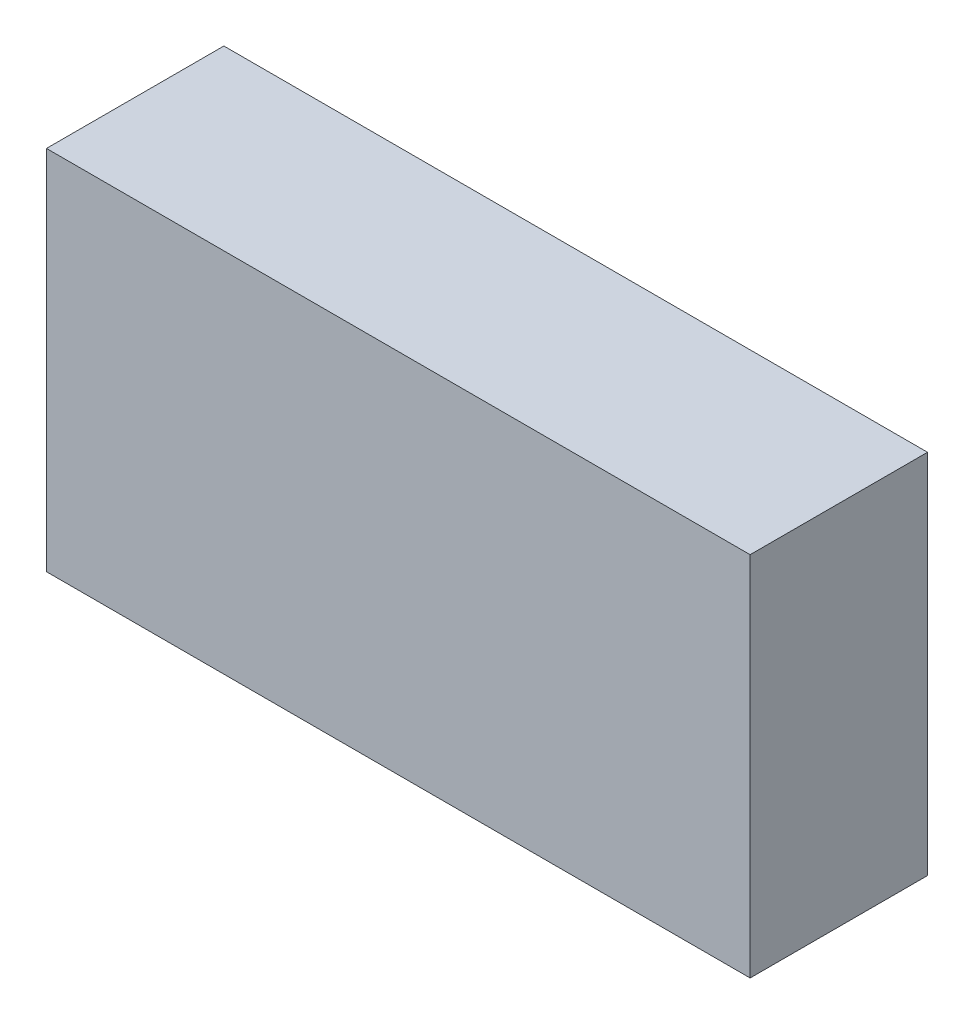
ISO-10303-21;
HEADER;
FILE_DESCRIPTION(('STEP AP214'),'2;1');
FILE_NAME('part.step','',(''),(''),'','','');
FILE_SCHEMA(('AUTOMOTIVE_DESIGN { 1 0 10303 214 1 1 1 1 }'));
ENDSEC;
DATA;
#1=APPLICATION_CONTEXT('core data for automotive mechanical design processes');
#2=APPLICATION_PROTOCOL_DEFINITION('international standard','automotive_design',2000,#1);
#3=PRODUCT_CONTEXT('',#1,'mechanical');
#4=PRODUCT('Part','Part','',(#3));
#5=PRODUCT_RELATED_PRODUCT_CATEGORY('part','',(#4));
#6=PRODUCT_DEFINITION_FORMATION('','',#4);
#7=PRODUCT_DEFINITION_CONTEXT('part definition',#1,'design');
#8=PRODUCT_DEFINITION('design','',#6,#7);
#9=PRODUCT_DEFINITION_SHAPE('','',#8);
#10=(LENGTH_UNIT() NAMED_UNIT(*) SI_UNIT(.MILLI.,.METRE.));
#11=(NAMED_UNIT(*) PLANE_ANGLE_UNIT() SI_UNIT($,.RADIAN.));
#12=(NAMED_UNIT(*) SI_UNIT($,.STERADIAN.) SOLID_ANGLE_UNIT());
#13=UNCERTAINTY_MEASURE_WITH_UNIT(LENGTH_MEASURE(1.E-05),#10,'distance_accuracy_value','');
#14=(GEOMETRIC_REPRESENTATION_CONTEXT(3) GLOBAL_UNCERTAINTY_ASSIGNED_CONTEXT((#13)) GLOBAL_UNIT_ASSIGNED_CONTEXT((#10,
#11,#12)) REPRESENTATION_CONTEXT('',''));
#15=CARTESIAN_POINT('',(0.,0.,0.));
#16=DIRECTION('',(0.,0.,1.));
#17=DIRECTION('',(1.,0.,0.));
#18=AXIS2_PLACEMENT_3D('',#15,#16,#17);
#19=CARTESIAN_POINT('',(-55.1794871794871,75.5128205128206,60.));
#20=DIRECTION('',(1.,0.,0.));
#21=DIRECTION('',(0.,0.,-1.));
#22=AXIS2_PLACEMENT_3D('',#19,#20,#21);
#23=PLANE('',#22);
#24=DIRECTION('',(0.,-1.,0.));
#25=VECTOR('',#24,1.);
#26=CARTESIAN_POINT('',(-55.1794871794871,75.5128205128206,0.));
#27=LINE('',#26,#25);
#28=CARTESIAN_POINT('',(-55.1794871794871,75.5128205128206,0.));
#29=VERTEX_POINT('',#28);
#30=CARTESIAN_POINT('',(-55.1794871794871,-48.4871794871794,0.));
#31=VERTEX_POINT('',#30);
#32=EDGE_CURVE('E107',#29,#31,#27,.T.);
#33=ORIENTED_EDGE('',*,*,#32,.T.);
#34=DIRECTION('',(0.,0.,-1.));
#35=VECTOR('',#34,1.);
#36=CARTESIAN_POINT('',(-55.1794871794871,-48.4871794871794,60.));
#37=LINE('',#36,#35);
#38=CARTESIAN_POINT('',(-55.1794871794871,-48.4871794871794,60.));
#39=VERTEX_POINT('',#38);
#40=EDGE_CURVE('E11',#39,#31,#37,.T.);
#41=ORIENTED_EDGE('',*,*,#40,.F.);
#42=DIRECTION('',(0.,-1.,0.));
#43=VECTOR('',#42,1.);
#44=CARTESIAN_POINT('',(-55.1794871794871,75.5128205128206,60.));
#45=LINE('',#44,#43);
#46=CARTESIAN_POINT('',(-55.1794871794871,75.5128205128206,60.));
#47=VERTEX_POINT('',#46);
#48=EDGE_CURVE('E91',#47,#39,#45,.T.);
#49=ORIENTED_EDGE('',*,*,#48,.F.);
#50=DIRECTION('',(0.,0.,-1.));
#51=VECTOR('',#50,1.);
#52=CARTESIAN_POINT('',(-55.1794871794871,75.5128205128206,60.));
#53=LINE('',#52,#51);
#54=EDGE_CURVE('E103',#47,#29,#53,.T.);
#55=ORIENTED_EDGE('',*,*,#54,.T.);
#56=EDGE_LOOP('',(#33,#41,#49,#55));
#57=FACE_BOUND('',#56,.T.);
#58=ADVANCED_FACE('F39',(#57),#23,.F.);
#59=CARTESIAN_POINT('',(-55.1794871794871,-48.4871794871794,60.));
#60=DIRECTION('',(0.,1.,0.));
#61=DIRECTION('',(0.,0.,1.));
#62=AXIS2_PLACEMENT_3D('',#59,#60,#61);
#63=PLANE('',#62);
#64=DIRECTION('',(1.,0.,0.));
#65=VECTOR('',#64,1.);
#66=CARTESIAN_POINT('',(-55.1794871794871,-48.4871794871794,0.));
#67=LINE('',#66,#65);
#68=CARTESIAN_POINT('',(182.820512820513,-48.4871794871794,0.));
#69=VERTEX_POINT('',#68);
#70=EDGE_CURVE('E96',#31,#69,#67,.T.);
#71=ORIENTED_EDGE('',*,*,#70,.T.);
#72=DIRECTION('',(0.,0.,-1.));
#73=VECTOR('',#72,1.);
#74=CARTESIAN_POINT('',(182.820512820513,-48.4871794871794,60.));
#75=LINE('',#74,#73);
#76=CARTESIAN_POINT('',(182.820512820513,-48.4871794871794,60.));
#77=VERTEX_POINT('',#76);
#78=EDGE_CURVE('E48',#77,#69,#75,.T.);
#79=ORIENTED_EDGE('',*,*,#78,.F.);
#80=DIRECTION('',(1.,0.,0.));
#81=VECTOR('',#80,1.);
#82=CARTESIAN_POINT('',(-55.1794871794871,-48.4871794871794,60.));
#83=LINE('',#82,#81);
#84=EDGE_CURVE('E86',#39,#77,#83,.T.);
#85=ORIENTED_EDGE('',*,*,#84,.F.);
#86=ORIENTED_EDGE('',*,*,#40,.T.);
#87=EDGE_LOOP('',(#71,#79,#85,#86));
#88=FACE_BOUND('',#87,.T.);
#89=ADVANCED_FACE('F95',(#88),#63,.F.);
#90=CARTESIAN_POINT('',(182.820512820513,75.5128205128206,60.));
#91=DIRECTION('',(-1.,0.,0.));
#92=DIRECTION('',(0.,0.,1.));
#93=AXIS2_PLACEMENT_3D('',#90,#91,#92);
#94=PLANE('',#93);
#95=DIRECTION('',(0.,1.,0.));
#96=VECTOR('',#95,1.);
#97=CARTESIAN_POINT('',(182.820512820513,75.5128205128206,0.));
#98=LINE('',#97,#96);
#99=CARTESIAN_POINT('',(182.820512820513,75.5128205128206,0.));
#100=VERTEX_POINT('',#99);
#101=EDGE_CURVE('E73',#69,#100,#98,.T.);
#102=ORIENTED_EDGE('',*,*,#101,.T.);
#103=DIRECTION('',(0.,0.,-1.));
#104=VECTOR('',#103,1.);
#105=CARTESIAN_POINT('',(182.820512820513,75.5128205128206,60.));
#106=LINE('',#105,#104);
#107=CARTESIAN_POINT('',(182.820512820513,75.5128205128206,60.));
#108=VERTEX_POINT('',#107);
#109=EDGE_CURVE('E98',#108,#100,#106,.T.);
#110=ORIENTED_EDGE('',*,*,#109,.F.);
#111=DIRECTION('',(0.,1.,0.));
#112=VECTOR('',#111,1.);
#113=CARTESIAN_POINT('',(182.820512820513,75.5128205128206,60.));
#114=LINE('',#113,#112);
#115=EDGE_CURVE('E89',#77,#108,#114,.T.);
#116=ORIENTED_EDGE('',*,*,#115,.F.);
#117=ORIENTED_EDGE('',*,*,#78,.T.);
#118=EDGE_LOOP('',(#102,#110,#116,#117));
#119=FACE_BOUND('',#118,.T.);
#120=ADVANCED_FACE('F99',(#119),#94,.F.);
#121=CARTESIAN_POINT('',(-55.1794871794871,75.5128205128206,60.));
#122=DIRECTION('',(0.,-1.,0.));
#123=DIRECTION('',(0.,0.,-1.));
#124=AXIS2_PLACEMENT_3D('',#121,#122,#123);
#125=PLANE('',#124);
#126=DIRECTION('',(-1.,0.,0.));
#127=VECTOR('',#126,1.);
#128=CARTESIAN_POINT('',(-55.1794871794871,75.5128205128206,0.));
#129=LINE('',#128,#127);
#130=EDGE_CURVE('E79',#100,#29,#129,.T.);
#131=ORIENTED_EDGE('',*,*,#130,.T.);
#132=ORIENTED_EDGE('',*,*,#54,.F.);
#133=DIRECTION('',(-1.,0.,0.));
#134=VECTOR('',#133,1.);
#135=CARTESIAN_POINT('',(-55.1794871794871,75.5128205128206,60.));
#136=LINE('',#135,#134);
#137=EDGE_CURVE('E56',#108,#47,#136,.T.);
#138=ORIENTED_EDGE('',*,*,#137,.F.);
#139=ORIENTED_EDGE('',*,*,#109,.T.);
#140=EDGE_LOOP('',(#131,#132,#138,#139));
#141=FACE_BOUND('',#140,.T.);
#142=ADVANCED_FACE('F120',(#141),#125,.F.);
#143=CARTESIAN_POINT('',(0.,0.,60.));
#144=DIRECTION('',(0.,0.,1.));
#145=DIRECTION('',(1.,0.,0.));
#146=AXIS2_PLACEMENT_3D('',#143,#144,#145);
#147=PLANE('',#146);
#148=ORIENTED_EDGE('',*,*,#48,.T.);
#149=ORIENTED_EDGE('',*,*,#84,.T.);
#150=ORIENTED_EDGE('',*,*,#115,.T.);
#151=ORIENTED_EDGE('',*,*,#137,.T.);
#152=EDGE_LOOP('',(#148,#149,#150,#151));
#153=FACE_BOUND('',#152,.T.);
#154=ADVANCED_FACE('F87',(#153),#147,.T.);
#155=CARTESIAN_POINT('',(0.,0.,0.));
#156=DIRECTION('',(0.,0.,1.));
#157=DIRECTION('',(1.,0.,0.));
#158=AXIS2_PLACEMENT_3D('',#155,#156,#157);
#159=PLANE('',#158);
#160=ORIENTED_EDGE('',*,*,#32,.F.);
#161=ORIENTED_EDGE('',*,*,#130,.F.);
#162=ORIENTED_EDGE('',*,*,#101,.F.);
#163=ORIENTED_EDGE('',*,*,#70,.F.);
#164=EDGE_LOOP('',(#160,#161,#162,#163));
#165=FACE_BOUND('',#164,.T.);
#166=ADVANCED_FACE('F123',(#165),#159,.F.);
#167=CLOSED_SHELL('',(#58,#89,#120,#142,#154,#166));
#168=MANIFOLD_SOLID_BREP('B2',#167);
#169=ADVANCED_BREP_SHAPE_REPRESENTATION('',(#18,#168),#14);
#170=SHAPE_DEFINITION_REPRESENTATION(#9,#169);
ENDSEC;
END-ISO-10303-21;
